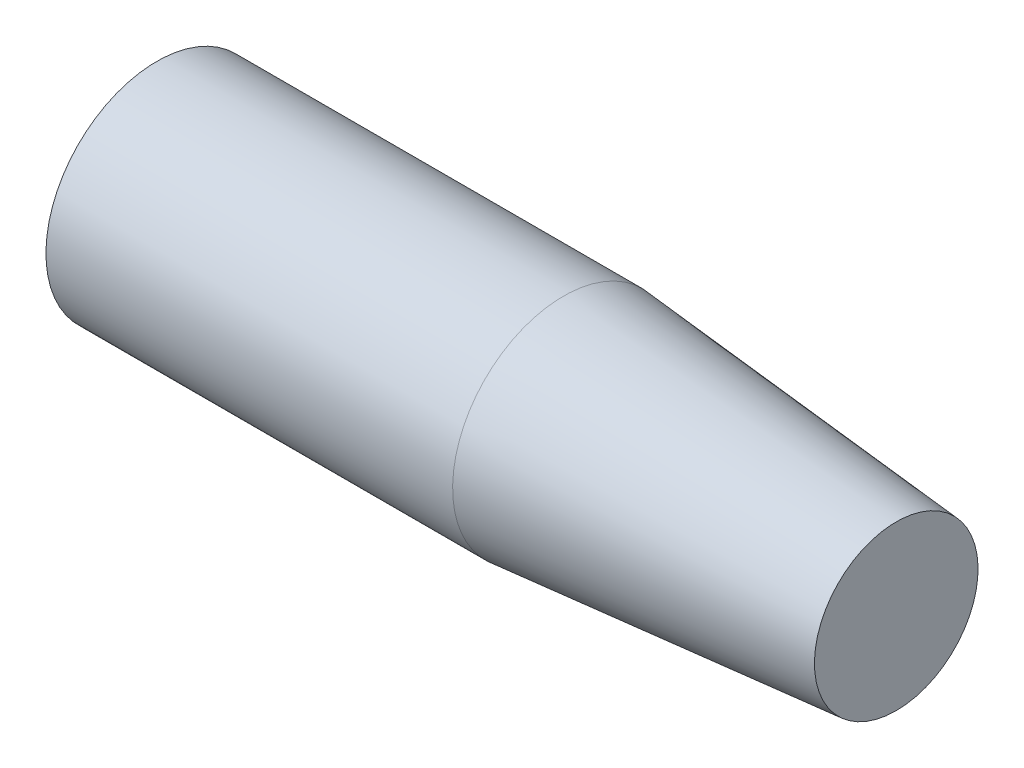
ISO-10303-21;
HEADER;
FILE_DESCRIPTION(('STEP AP214'),'2;1');
FILE_NAME('part.step','',(''),(''),'','','');
FILE_SCHEMA(('AUTOMOTIVE_DESIGN { 1 0 10303 214 1 1 1 1 }'));
ENDSEC;
DATA;
#1=APPLICATION_CONTEXT('core data for automotive mechanical design processes');
#2=APPLICATION_PROTOCOL_DEFINITION('international standard','automotive_design',2000,#1);
#3=PRODUCT_CONTEXT('',#1,'mechanical');
#4=PRODUCT('Part','Part','',(#3));
#5=PRODUCT_RELATED_PRODUCT_CATEGORY('part','',(#4));
#6=PRODUCT_DEFINITION_FORMATION('','',#4);
#7=PRODUCT_DEFINITION_CONTEXT('part definition',#1,'design');
#8=PRODUCT_DEFINITION('design','',#6,#7);
#9=PRODUCT_DEFINITION_SHAPE('','',#8);
#10=(LENGTH_UNIT() NAMED_UNIT(*) SI_UNIT(.MILLI.,.METRE.));
#11=(NAMED_UNIT(*) PLANE_ANGLE_UNIT() SI_UNIT($,.RADIAN.));
#12=(NAMED_UNIT(*) SI_UNIT($,.STERADIAN.) SOLID_ANGLE_UNIT());
#13=UNCERTAINTY_MEASURE_WITH_UNIT(LENGTH_MEASURE(1.E-05),#10,'distance_accuracy_value','');
#14=(GEOMETRIC_REPRESENTATION_CONTEXT(3) GLOBAL_UNCERTAINTY_ASSIGNED_CONTEXT((#13)) GLOBAL_UNIT_ASSIGNED_CONTEXT((#10,
#11,#12)) REPRESENTATION_CONTEXT('',''));
#15=CARTESIAN_POINT('',(0.,0.,0.));
#16=DIRECTION('',(0.,0.,1.));
#17=DIRECTION('',(1.,0.,0.));
#18=AXIS2_PLACEMENT_3D('',#15,#16,#17);
#19=CARTESIAN_POINT('',(0.,0.,0.));
#20=DIRECTION('',(1.,0.,0.));
#21=DIRECTION('',(0.,1.,0.));
#22=AXIS2_PLACEMENT_3D('',#19,#20,#21);
#23=PLANE('',#22);
#24=DIRECTION('',(0.,0.866025403784439,-0.5));
#25=VECTOR('',#24,1.);
#26=CARTESIAN_POINT('',(0.,0.,1.73205080756888));
#27=LINE('',#26,#25);
#28=CARTESIAN_POINT('',(0.,0.,1.73205080756888));
#29=VERTEX_POINT('',#28);
#30=CARTESIAN_POINT('',(0.,1.5,0.866025403784439));
#31=VERTEX_POINT('',#30);
#32=EDGE_CURVE('E125',#29,#31,#27,.T.);
#33=ORIENTED_EDGE('',*,*,#32,.F.);
#34=DIRECTION('',(0.,0.866025403784439,0.5));
#35=VECTOR('',#34,1.);
#36=CARTESIAN_POINT('',(0.,-1.5,0.866025403784438));
#37=LINE('',#36,#35);
#38=CARTESIAN_POINT('',(0.,-1.5,0.866025403784438));
#39=VERTEX_POINT('',#38);
#40=EDGE_CURVE('E51',#39,#29,#37,.T.);
#41=ORIENTED_EDGE('',*,*,#40,.F.);
#42=DIRECTION('',(0.,0.,1.));
#43=VECTOR('',#42,1.);
#44=CARTESIAN_POINT('',(0.,-1.5,-0.866025403784439));
#45=LINE('',#44,#43);
#46=CARTESIAN_POINT('',(0.,-1.5,-0.866025403784439));
#47=VERTEX_POINT('',#46);
#48=EDGE_CURVE('E134',#47,#39,#45,.T.);
#49=ORIENTED_EDGE('',*,*,#48,.F.);
#50=DIRECTION('',(0.,-0.866025403784439,0.5));
#51=VECTOR('',#50,1.);
#52=CARTESIAN_POINT('',(0.,0.,-1.73205080756888));
#53=LINE('',#52,#51);
#54=CARTESIAN_POINT('',(0.,0.,-1.73205080756888));
#55=VERTEX_POINT('',#54);
#56=EDGE_CURVE('E132',#55,#47,#53,.T.);
#57=ORIENTED_EDGE('',*,*,#56,.F.);
#58=DIRECTION('',(0.,-0.866025403784439,-0.5));
#59=VECTOR('',#58,1.);
#60=CARTESIAN_POINT('',(0.,1.5,-0.866025403784438));
#61=LINE('',#60,#59);
#62=CARTESIAN_POINT('',(0.,1.5,-0.866025403784438));
#63=VERTEX_POINT('',#62);
#64=EDGE_CURVE('E99',#63,#55,#61,.T.);
#65=ORIENTED_EDGE('',*,*,#64,.F.);
#66=DIRECTION('',(0.,0.,-1.));
#67=VECTOR('',#66,1.);
#68=CARTESIAN_POINT('',(0.,1.5,0.866025403784439));
#69=LINE('',#68,#67);
#70=EDGE_CURVE('E128',#31,#63,#69,.T.);
#71=ORIENTED_EDGE('',*,*,#70,.F.);
#72=EDGE_LOOP('',(#33,#41,#49,#57,#65,#71));
#73=FACE_BOUND('',#72,.T.);
#74=CARTESIAN_POINT('',(0.,0.,0.));
#75=DIRECTION('',(-1.,0.,0.));
#76=DIRECTION('',(0.,-1.,0.));
#77=AXIS2_PLACEMENT_3D('',#74,#75,#76);
#78=CIRCLE('',#77,3.);
#79=CARTESIAN_POINT('',(0.,-3.,0.));
#80=VERTEX_POINT('',#79);
#81=EDGE_CURVE('E11',#80,#80,#78,.T.);
#82=ORIENTED_EDGE('',*,*,#81,.T.);
#83=EDGE_LOOP('',(#82));
#84=FACE_BOUND('',#83,.T.);
#85=ADVANCED_FACE('F37',(#73,#84),#23,.F.);
#86=CARTESIAN_POINT('',(0.,0.,0.));
#87=DIRECTION('',(-1.,0.,0.));
#88=DIRECTION('',(0.,-1.,0.));
#89=AXIS2_PLACEMENT_3D('',#86,#87,#88);
#90=CYLINDRICAL_SURFACE('',#89,3.);
#91=ORIENTED_EDGE('',*,*,#81,.F.);
#92=EDGE_LOOP('',(#91));
#93=FACE_BOUND('',#92,.T.);
#94=CARTESIAN_POINT('',(11.,0.,0.));
#95=DIRECTION('',(-1.,0.,0.));
#96=DIRECTION('',(0.,-1.,0.));
#97=AXIS2_PLACEMENT_3D('',#94,#95,#96);
#98=CIRCLE('',#97,3.);
#99=CARTESIAN_POINT('',(11.,-3.,0.));
#100=VERTEX_POINT('',#99);
#101=EDGE_CURVE('E44',#100,#100,#98,.T.);
#102=ORIENTED_EDGE('',*,*,#101,.T.);
#103=EDGE_LOOP('',(#102));
#104=FACE_BOUND('',#103,.T.);
#105=ADVANCED_FACE('F148',(#93,#104),#90,.T.);
#106=CARTESIAN_POINT('',(20.,0.,0.));
#107=DIRECTION('',(-1.,0.,0.));
#108=DIRECTION('',(0.,-1.,0.));
#109=AXIS2_PLACEMENT_3D('',#106,#107,#108);
#110=CONICAL_SURFACE('',#109,2.21260202826668,0.0872664625997169);
#111=ORIENTED_EDGE('',*,*,#101,.F.);
#112=EDGE_LOOP('',(#111));
#113=FACE_BOUND('',#112,.T.);
#114=CARTESIAN_POINT('',(20.,0.,0.));
#115=DIRECTION('',(-1.,0.,0.));
#116=DIRECTION('',(0.,-1.,0.));
#117=AXIS2_PLACEMENT_3D('',#114,#115,#116);
#118=CIRCLE('',#117,2.21260202826668);
#119=CARTESIAN_POINT('',(20.,-2.21260202826668,0.));
#120=VERTEX_POINT('',#119);
#121=EDGE_CURVE('E138',#120,#120,#118,.T.);
#122=ORIENTED_EDGE('',*,*,#121,.T.);
#123=EDGE_LOOP('',(#122));
#124=FACE_BOUND('',#123,.T.);
#125=ADVANCED_FACE('F150',(#113,#124),#110,.T.);
#126=CARTESIAN_POINT('',(20.,2.21260202826668,0.));
#127=DIRECTION('',(-1.,0.,0.));
#128=DIRECTION('',(0.,-1.,0.));
#129=AXIS2_PLACEMENT_3D('',#126,#127,#128);
#130=PLANE('',#129);
#131=ORIENTED_EDGE('',*,*,#121,.F.);
#132=EDGE_LOOP('',(#131));
#133=FACE_BOUND('',#132,.T.);
#134=ADVANCED_FACE('F153',(#133),#130,.F.);
#135=CARTESIAN_POINT('',(6.,-1.5,0.866025403784438));
#136=DIRECTION('',(0.,-0.5,0.866025403784438));
#137=DIRECTION('',(0.,-0.866025403784439,-0.5));
#138=AXIS2_PLACEMENT_3D('',#135,#136,#137);
#139=PLANE('',#138);
#140=ORIENTED_EDGE('',*,*,#40,.T.);
#141=DIRECTION('',(-1.,0.,0.));
#142=VECTOR('',#141,1.);
#143=CARTESIAN_POINT('',(6.,0.,1.73205080756888));
#144=LINE('',#143,#142);
#145=CARTESIAN_POINT('',(6.,0.,1.73205080756888));
#146=VERTEX_POINT('',#145);
#147=EDGE_CURVE('E81',#146,#29,#144,.T.);
#148=ORIENTED_EDGE('',*,*,#147,.F.);
#149=DIRECTION('',(0.,0.866025403784439,0.5));
#150=VECTOR('',#149,1.);
#151=CARTESIAN_POINT('',(6.,-1.5,0.866025403784438));
#152=LINE('',#151,#150);
#153=CARTESIAN_POINT('',(6.,-1.5,0.866025403784438));
#154=VERTEX_POINT('',#153);
#155=EDGE_CURVE('E136',#154,#146,#152,.T.);
#156=ORIENTED_EDGE('',*,*,#155,.F.);
#157=DIRECTION('',(-1.,0.,0.));
#158=VECTOR('',#157,1.);
#159=CARTESIAN_POINT('',(6.,-1.5,0.866025403784438));
#160=LINE('',#159,#158);
#161=EDGE_CURVE('E59',#154,#39,#160,.T.);
#162=ORIENTED_EDGE('',*,*,#161,.T.);
#163=EDGE_LOOP('',(#140,#148,#156,#162));
#164=FACE_BOUND('',#163,.T.);
#165=ADVANCED_FACE('F158',(#164),#139,.F.);
#166=CARTESIAN_POINT('',(6.,-1.5,-0.866025403784439));
#167=DIRECTION('',(0.,-1.,0.));
#168=DIRECTION('',(0.,0.,-1.));
#169=AXIS2_PLACEMENT_3D('',#166,#167,#168);
#170=PLANE('',#169);
#171=ORIENTED_EDGE('',*,*,#48,.T.);
#172=ORIENTED_EDGE('',*,*,#161,.F.);
#173=DIRECTION('',(0.,0.,1.));
#174=VECTOR('',#173,1.);
#175=CARTESIAN_POINT('',(6.,-1.5,-0.866025403784439));
#176=LINE('',#175,#174);
#177=CARTESIAN_POINT('',(6.,-1.5,-0.866025403784439));
#178=VERTEX_POINT('',#177);
#179=EDGE_CURVE('E111',#178,#154,#176,.T.);
#180=ORIENTED_EDGE('',*,*,#179,.F.);
#181=DIRECTION('',(-1.,0.,0.));
#182=VECTOR('',#181,1.);
#183=CARTESIAN_POINT('',(6.,-1.5,-0.866025403784439));
#184=LINE('',#183,#182);
#185=EDGE_CURVE('E103',#178,#47,#184,.T.);
#186=ORIENTED_EDGE('',*,*,#185,.T.);
#187=EDGE_LOOP('',(#171,#172,#180,#186));
#188=FACE_BOUND('',#187,.T.);
#189=ADVANCED_FACE('F163',(#188),#170,.F.);
#190=CARTESIAN_POINT('',(6.,0.,-1.73205080756888));
#191=DIRECTION('',(0.,-0.5,-0.866025403784439));
#192=DIRECTION('',(0.,0.866025403784439,-0.5));
#193=AXIS2_PLACEMENT_3D('',#190,#191,#192);
#194=PLANE('',#193);
#195=ORIENTED_EDGE('',*,*,#56,.T.);
#196=ORIENTED_EDGE('',*,*,#185,.F.);
#197=DIRECTION('',(0.,-0.866025403784439,0.5));
#198=VECTOR('',#197,1.);
#199=CARTESIAN_POINT('',(6.,0.,-1.73205080756888));
#200=LINE('',#199,#198);
#201=CARTESIAN_POINT('',(6.,0.,-1.73205080756888));
#202=VERTEX_POINT('',#201);
#203=EDGE_CURVE('E107',#202,#178,#200,.T.);
#204=ORIENTED_EDGE('',*,*,#203,.F.);
#205=DIRECTION('',(-1.,0.,0.));
#206=VECTOR('',#205,1.);
#207=CARTESIAN_POINT('',(6.,0.,-1.73205080756888));
#208=LINE('',#207,#206);
#209=EDGE_CURVE('E92',#202,#55,#208,.T.);
#210=ORIENTED_EDGE('',*,*,#209,.T.);
#211=EDGE_LOOP('',(#195,#196,#204,#210));
#212=FACE_BOUND('',#211,.T.);
#213=ADVANCED_FACE('F108',(#212),#194,.F.);
#214=CARTESIAN_POINT('',(6.,1.5,-0.866025403784438));
#215=DIRECTION('',(0.,0.5,-0.866025403784439));
#216=DIRECTION('',(0.,0.866025403784439,0.5));
#217=AXIS2_PLACEMENT_3D('',#214,#215,#216);
#218=PLANE('',#217);
#219=ORIENTED_EDGE('',*,*,#64,.T.);
#220=ORIENTED_EDGE('',*,*,#209,.F.);
#221=DIRECTION('',(0.,-0.866025403784439,-0.5));
#222=VECTOR('',#221,1.);
#223=CARTESIAN_POINT('',(6.,1.5,-0.866025403784438));
#224=LINE('',#223,#222);
#225=CARTESIAN_POINT('',(6.,1.5,-0.866025403784438));
#226=VERTEX_POINT('',#225);
#227=EDGE_CURVE('E96',#226,#202,#224,.T.);
#228=ORIENTED_EDGE('',*,*,#227,.F.);
#229=DIRECTION('',(-1.,0.,0.));
#230=VECTOR('',#229,1.);
#231=CARTESIAN_POINT('',(6.,1.5,-0.866025403784438));
#232=LINE('',#231,#230);
#233=EDGE_CURVE('E104',#226,#63,#232,.T.);
#234=ORIENTED_EDGE('',*,*,#233,.T.);
#235=EDGE_LOOP('',(#219,#220,#228,#234));
#236=FACE_BOUND('',#235,.T.);
#237=ADVANCED_FACE('F94',(#236),#218,.F.);
#238=CARTESIAN_POINT('',(6.,1.5,0.866025403784439));
#239=DIRECTION('',(0.,1.,0.));
#240=DIRECTION('',(-1.,0.,0.));
#241=AXIS2_PLACEMENT_3D('',#238,#239,#240);
#242=PLANE('',#241);
#243=ORIENTED_EDGE('',*,*,#70,.T.);
#244=ORIENTED_EDGE('',*,*,#233,.F.);
#245=DIRECTION('',(0.,0.,-1.));
#246=VECTOR('',#245,1.);
#247=CARTESIAN_POINT('',(6.,1.5,0.866025403784439));
#248=LINE('',#247,#246);
#249=CARTESIAN_POINT('',(6.,1.5,0.866025403784439));
#250=VERTEX_POINT('',#249);
#251=EDGE_CURVE('E117',#250,#226,#248,.T.);
#252=ORIENTED_EDGE('',*,*,#251,.F.);
#253=DIRECTION('',(-1.,0.,0.));
#254=VECTOR('',#253,1.);
#255=CARTESIAN_POINT('',(6.,1.5,0.866025403784439));
#256=LINE('',#255,#254);
#257=EDGE_CURVE('E141',#250,#31,#256,.T.);
#258=ORIENTED_EDGE('',*,*,#257,.T.);
#259=EDGE_LOOP('',(#243,#244,#252,#258));
#260=FACE_BOUND('',#259,.T.);
#261=ADVANCED_FACE('F189',(#260),#242,.F.);
#262=CARTESIAN_POINT('',(6.,0.,1.73205080756888));
#263=DIRECTION('',(0.,0.5,0.866025403784439));
#264=DIRECTION('',(0.,-0.866025403784439,0.5));
#265=AXIS2_PLACEMENT_3D('',#262,#263,#264);
#266=PLANE('',#265);
#267=ORIENTED_EDGE('',*,*,#32,.T.);
#268=ORIENTED_EDGE('',*,*,#257,.F.);
#269=DIRECTION('',(0.,0.866025403784439,-0.5));
#270=VECTOR('',#269,1.);
#271=CARTESIAN_POINT('',(6.,0.,1.73205080756888));
#272=LINE('',#271,#270);
#273=EDGE_CURVE('E119',#146,#250,#272,.T.);
#274=ORIENTED_EDGE('',*,*,#273,.F.);
#275=ORIENTED_EDGE('',*,*,#147,.T.);
#276=EDGE_LOOP('',(#267,#268,#274,#275));
#277=FACE_BOUND('',#276,.T.);
#278=ADVANCED_FACE('F177',(#277),#266,.F.);
#279=CARTESIAN_POINT('',(6.,0.,0.));
#280=DIRECTION('',(-1.,0.,0.));
#281=DIRECTION('',(0.,-1.,0.));
#282=AXIS2_PLACEMENT_3D('',#279,#280,#281);
#283=PLANE('',#282);
#284=ORIENTED_EDGE('',*,*,#155,.T.);
#285=ORIENTED_EDGE('',*,*,#273,.T.);
#286=ORIENTED_EDGE('',*,*,#251,.T.);
#287=ORIENTED_EDGE('',*,*,#227,.T.);
#288=ORIENTED_EDGE('',*,*,#203,.T.);
#289=ORIENTED_EDGE('',*,*,#179,.T.);
#290=EDGE_LOOP('',(#284,#285,#286,#287,#288,#289));
#291=FACE_BOUND('',#290,.T.);
#292=ADVANCED_FACE('F114',(#291),#283,.T.);
#293=CLOSED_SHELL('',(#85,#105,#125,#134,#165,#189,#213,#237,#261,#278,#292));
#294=MANIFOLD_SOLID_BREP('B2',#293);
#295=ADVANCED_BREP_SHAPE_REPRESENTATION('',(#18,#294),#14);
#296=SHAPE_DEFINITION_REPRESENTATION(#9,#295);
ENDSEC;
END-ISO-10303-21;
